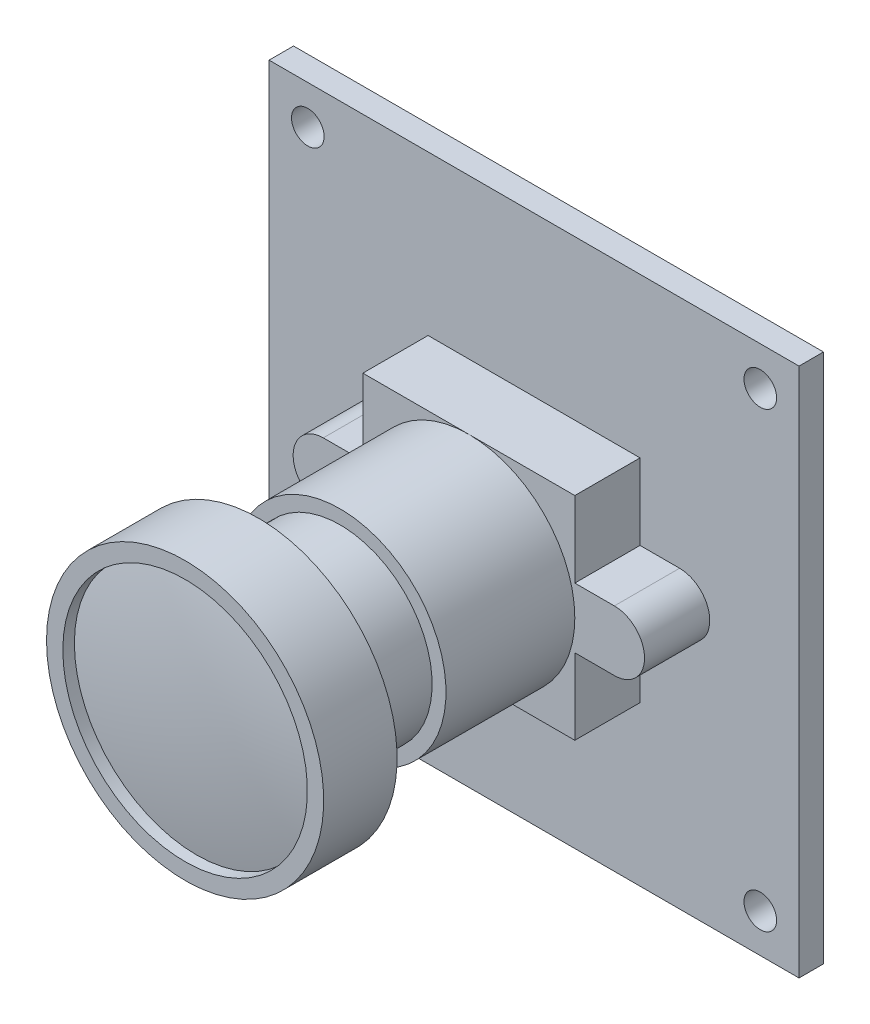
ISO-10303-21;
HEADER;
FILE_DESCRIPTION(('STEP AP214'),'2;1');
FILE_NAME('part.step','',(''),(''),'','','');
FILE_SCHEMA(('AUTOMOTIVE_DESIGN { 1 0 10303 214 1 1 1 1 }'));
ENDSEC;
DATA;
#1=APPLICATION_CONTEXT('core data for automotive mechanical design processes');
#2=APPLICATION_PROTOCOL_DEFINITION('international standard','automotive_design',2000,#1);
#3=PRODUCT_CONTEXT('',#1,'mechanical');
#4=PRODUCT('Part','Part','',(#3));
#5=PRODUCT_RELATED_PRODUCT_CATEGORY('part','',(#4));
#6=PRODUCT_DEFINITION_FORMATION('','',#4);
#7=PRODUCT_DEFINITION_CONTEXT('part definition',#1,'design');
#8=PRODUCT_DEFINITION('design','',#6,#7);
#9=PRODUCT_DEFINITION_SHAPE('','',#8);
#10=(LENGTH_UNIT() NAMED_UNIT(*) SI_UNIT(.MILLI.,.METRE.));
#11=(NAMED_UNIT(*) PLANE_ANGLE_UNIT() SI_UNIT($,.RADIAN.));
#12=(NAMED_UNIT(*) SI_UNIT($,.STERADIAN.) SOLID_ANGLE_UNIT());
#13=UNCERTAINTY_MEASURE_WITH_UNIT(LENGTH_MEASURE(1.E-05),#10,'distance_accuracy_value','');
#14=(GEOMETRIC_REPRESENTATION_CONTEXT(3) GLOBAL_UNCERTAINTY_ASSIGNED_CONTEXT((#13)) GLOBAL_UNIT_ASSIGNED_CONTEXT((#10,
#11,#12)) REPRESENTATION_CONTEXT('',''));
#15=CARTESIAN_POINT('',(0.,0.,0.));
#16=DIRECTION('',(0.,0.,1.));
#17=DIRECTION('',(1.,0.,0.));
#18=AXIS2_PLACEMENT_3D('',#15,#16,#17);
#19=CARTESIAN_POINT('',(0.,0.,0.));
#20=DIRECTION('',(0.,0.,1.));
#21=DIRECTION('',(1.,0.,0.));
#22=AXIS2_PLACEMENT_3D('',#19,#20,#21);
#23=PLANE('',#22);
#24=CARTESIAN_POINT('',(-13.875,13.875,0.));
#25=DIRECTION('',(0.,0.,1.));
#26=DIRECTION('',(1.,0.,0.));
#27=AXIS2_PLACEMENT_3D('',#24,#25,#26);
#28=CIRCLE('',#27,1.);
#29=CARTESIAN_POINT('',(-12.875,13.875,0.));
#30=VERTEX_POINT('',#29);
#31=EDGE_CURVE('E396',#30,#30,#28,.T.);
#32=ORIENTED_EDGE('',*,*,#31,.T.);
#33=EDGE_LOOP('',(#32));
#34=FACE_BOUND('',#33,.T.);
#35=CARTESIAN_POINT('',(-13.875,-13.875,0.));
#36=DIRECTION('',(0.,0.,1.));
#37=DIRECTION('',(1.,0.,0.));
#38=AXIS2_PLACEMENT_3D('',#35,#36,#37);
#39=CIRCLE('',#38,1.);
#40=CARTESIAN_POINT('',(-12.875,-13.875,0.));
#41=VERTEX_POINT('',#40);
#42=EDGE_CURVE('E401',#41,#41,#39,.T.);
#43=ORIENTED_EDGE('',*,*,#42,.T.);
#44=EDGE_LOOP('',(#43));
#45=FACE_BOUND('',#44,.T.);
#46=CARTESIAN_POINT('',(13.875,-13.875,0.));
#47=DIRECTION('',(0.,0.,1.));
#48=DIRECTION('',(1.,0.,0.));
#49=AXIS2_PLACEMENT_3D('',#46,#47,#48);
#50=CIRCLE('',#49,1.);
#51=CARTESIAN_POINT('',(14.875,-13.875,0.));
#52=VERTEX_POINT('',#51);
#53=EDGE_CURVE('E409',#52,#52,#50,.T.);
#54=ORIENTED_EDGE('',*,*,#53,.T.);
#55=EDGE_LOOP('',(#54));
#56=FACE_BOUND('',#55,.T.);
#57=CARTESIAN_POINT('',(13.875,13.875,0.));
#58=DIRECTION('',(0.,0.,1.));
#59=DIRECTION('',(1.,0.,0.));
#60=AXIS2_PLACEMENT_3D('',#57,#58,#59);
#61=CIRCLE('',#60,1.);
#62=CARTESIAN_POINT('',(14.875,13.875,0.));
#63=VERTEX_POINT('',#62);
#64=EDGE_CURVE('E417',#63,#63,#61,.T.);
#65=ORIENTED_EDGE('',*,*,#64,.T.);
#66=EDGE_LOOP('',(#65));
#67=FACE_BOUND('',#66,.T.);
#68=DIRECTION('',(0.,-1.,0.));
#69=VECTOR('',#68,1.);
#70=CARTESIAN_POINT('',(5.,-16.25,0.));
#71=LINE('',#70,#69);
#72=CARTESIAN_POINT('',(5.,-11.5,0.));
#73=VERTEX_POINT('',#72);
#74=CARTESIAN_POINT('',(5.,-16.25,0.));
#75=VERTEX_POINT('',#74);
#76=EDGE_CURVE('E93',#73,#75,#71,.T.);
#77=ORIENTED_EDGE('',*,*,#76,.F.);
#78=DIRECTION('',(1.,0.,0.));
#79=VECTOR('',#78,1.);
#80=CARTESIAN_POINT('',(-5.,-11.5,0.));
#81=LINE('',#80,#79);
#82=CARTESIAN_POINT('',(-5.,-11.5,0.));
#83=VERTEX_POINT('',#82);
#84=EDGE_CURVE('E241',#83,#73,#81,.T.);
#85=ORIENTED_EDGE('',*,*,#84,.F.);
#86=DIRECTION('',(0.,1.,0.));
#87=VECTOR('',#86,1.);
#88=CARTESIAN_POINT('',(-5.,-16.25,0.));
#89=LINE('',#88,#87);
#90=CARTESIAN_POINT('',(-5.,-16.25,0.));
#91=VERTEX_POINT('',#90);
#92=EDGE_CURVE('E476',#91,#83,#89,.T.);
#93=ORIENTED_EDGE('',*,*,#92,.F.);
#94=DIRECTION('',(1.,0.,0.));
#95=VECTOR('',#94,1.);
#96=CARTESIAN_POINT('',(16.25,-16.25,0.));
#97=LINE('',#96,#95);
#98=CARTESIAN_POINT('',(-16.25,-16.25,0.));
#99=VERTEX_POINT('',#98);
#100=EDGE_CURVE('E447',#99,#91,#97,.T.);
#101=ORIENTED_EDGE('',*,*,#100,.F.);
#102=DIRECTION('',(0.,-1.,0.));
#103=VECTOR('',#102,1.);
#104=CARTESIAN_POINT('',(-16.25,-16.25,0.));
#105=LINE('',#104,#103);
#106=CARTESIAN_POINT('',(-16.25,16.25,0.));
#107=VERTEX_POINT('',#106);
#108=EDGE_CURVE('E425',#107,#99,#105,.T.);
#109=ORIENTED_EDGE('',*,*,#108,.F.);
#110=DIRECTION('',(-1.,0.,0.));
#111=VECTOR('',#110,1.);
#112=CARTESIAN_POINT('',(16.25,16.25,0.));
#113=LINE('',#112,#111);
#114=CARTESIAN_POINT('',(16.25,16.25,0.));
#115=VERTEX_POINT('',#114);
#116=EDGE_CURVE('E434',#115,#107,#113,.T.);
#117=ORIENTED_EDGE('',*,*,#116,.F.);
#118=DIRECTION('',(0.,1.,0.));
#119=VECTOR('',#118,1.);
#120=CARTESIAN_POINT('',(16.25,-16.25,0.));
#121=LINE('',#120,#119);
#122=CARTESIAN_POINT('',(16.25,-16.25,0.));
#123=VERTEX_POINT('',#122);
#124=EDGE_CURVE('E450',#123,#115,#121,.T.);
#125=ORIENTED_EDGE('',*,*,#124,.F.);
#126=EDGE_CURVE('E98',#75,#123,#97,.T.);
#127=ORIENTED_EDGE('',*,*,#126,.F.);
#128=EDGE_LOOP('',(#77,#85,#93,#101,#109,#117,#125,#127));
#129=FACE_BOUND('',#128,.T.);
#130=ADVANCED_FACE('F75',(#34,#45,#56,#67,#129),#23,.F.);
#131=CARTESIAN_POINT('',(0.,0.,5.5));
#132=DIRECTION('',(0.,0.,-1.));
#133=DIRECTION('',(-1.,0.,0.));
#134=AXIS2_PLACEMENT_3D('',#131,#132,#133);
#135=PLANE('',#134);
#136=DIRECTION('',(-1.,0.,0.));
#137=VECTOR('',#136,1.);
#138=CARTESIAN_POINT('',(6.5,6.5,5.5));
#139=LINE('',#138,#137);
#140=CARTESIAN_POINT('',(6.5,6.5,5.5));
#141=VERTEX_POINT('',#140);
#142=CARTESIAN_POINT('',(0.,6.5,5.5));
#143=VERTEX_POINT('',#142);
#144=EDGE_CURVE('E282',#141,#143,#139,.T.);
#145=ORIENTED_EDGE('',*,*,#144,.T.);
#146=CARTESIAN_POINT('',(0.,0.,5.5));
#147=DIRECTION('',(0.,0.,-1.));
#148=DIRECTION('',(-1.,0.,0.));
#149=AXIS2_PLACEMENT_3D('',#146,#147,#148);
#150=CIRCLE('',#149,6.5);
#151=CARTESIAN_POINT('',(0.,-6.5,5.5));
#152=VERTEX_POINT('',#151);
#153=EDGE_CURVE('E86',#143,#152,#150,.T.);
#154=ORIENTED_EDGE('',*,*,#153,.T.);
#155=DIRECTION('',(-1.,0.,0.));
#156=VECTOR('',#155,1.);
#157=CARTESIAN_POINT('',(6.5,-6.5,5.5));
#158=LINE('',#157,#156);
#159=CARTESIAN_POINT('',(6.5,-6.5,5.5));
#160=VERTEX_POINT('',#159);
#161=EDGE_CURVE('E293',#160,#152,#158,.T.);
#162=ORIENTED_EDGE('',*,*,#161,.F.);
#163=DIRECTION('',(0.,1.,0.));
#164=VECTOR('',#163,1.);
#165=CARTESIAN_POINT('',(6.5,-6.5,5.5));
#166=LINE('',#165,#164);
#167=CARTESIAN_POINT('',(6.5,-1.85,5.5));
#168=VERTEX_POINT('',#167);
#169=EDGE_CURVE('E298',#160,#168,#166,.T.);
#170=ORIENTED_EDGE('',*,*,#169,.T.);
#171=DIRECTION('',(-1.,0.,0.));
#172=VECTOR('',#171,1.);
#173=CARTESIAN_POINT('',(8.925,-1.84999999999999,5.5));
#174=LINE('',#173,#172);
#175=CARTESIAN_POINT('',(8.925,-1.84999999999999,5.5));
#176=VERTEX_POINT('',#175);
#177=EDGE_CURVE('E351',#176,#168,#174,.T.);
#178=ORIENTED_EDGE('',*,*,#177,.F.);
#179=CARTESIAN_POINT('',(8.925,0.,5.5));
#180=DIRECTION('',(0.,0.,1.));
#181=DIRECTION('',(1.,0.,0.));
#182=AXIS2_PLACEMENT_3D('',#179,#180,#181);
#183=CIRCLE('',#182,1.85);
#184=CARTESIAN_POINT('',(8.925,1.85000000000001,5.5));
#185=VERTEX_POINT('',#184);
#186=EDGE_CURVE('E336',#176,#185,#183,.T.);
#187=ORIENTED_EDGE('',*,*,#186,.T.);
#188=DIRECTION('',(-1.,0.,0.));
#189=VECTOR('',#188,1.);
#190=CARTESIAN_POINT('',(8.925,1.85000000000001,5.5));
#191=LINE('',#190,#189);
#192=CARTESIAN_POINT('',(6.5,1.85,5.5));
#193=VERTEX_POINT('',#192);
#194=EDGE_CURVE('E342',#185,#193,#191,.T.);
#195=ORIENTED_EDGE('',*,*,#194,.T.);
#196=EDGE_CURVE('E297',#193,#141,#166,.T.);
#197=ORIENTED_EDGE('',*,*,#196,.T.);
#198=EDGE_LOOP('',(#145,#154,#162,#170,#178,#187,#195,#197));
#199=FACE_BOUND('',#198,.T.);
#200=ADVANCED_FACE('F507',(#199),#135,.F.);
#201=CARTESIAN_POINT('',(0.,0.,1.5));
#202=DIRECTION('',(0.,0.,1.));
#203=DIRECTION('',(1.,0.,0.));
#204=AXIS2_PLACEMENT_3D('',#201,#202,#203);
#205=PLANE('',#204);
#206=DIRECTION('',(-1.,0.,0.));
#207=VECTOR('',#206,1.);
#208=CARTESIAN_POINT('',(8.925,-1.84999999999999,1.5));
#209=LINE('',#208,#207);
#210=CARTESIAN_POINT('',(8.925,-1.85,1.5));
#211=VERTEX_POINT('',#210);
#212=CARTESIAN_POINT('',(6.5,-1.85,1.5));
#213=VERTEX_POINT('',#212);
#214=EDGE_CURVE('E341',#211,#213,#209,.T.);
#215=ORIENTED_EDGE('',*,*,#214,.T.);
#216=DIRECTION('',(0.,1.,0.));
#217=VECTOR('',#216,1.);
#218=CARTESIAN_POINT('',(6.5,-6.5,1.5));
#219=LINE('',#218,#217);
#220=CARTESIAN_POINT('',(6.5,-6.5,1.5));
#221=VERTEX_POINT('',#220);
#222=EDGE_CURVE('E316',#221,#213,#219,.T.);
#223=ORIENTED_EDGE('',*,*,#222,.F.);
#224=DIRECTION('',(-1.,0.,0.));
#225=VECTOR('',#224,1.);
#226=CARTESIAN_POINT('',(6.5,-6.5,1.5));
#227=LINE('',#226,#225);
#228=CARTESIAN_POINT('',(-6.5,-6.5,1.5));
#229=VERTEX_POINT('',#228);
#230=EDGE_CURVE('E312',#221,#229,#227,.T.);
#231=ORIENTED_EDGE('',*,*,#230,.T.);
#232=DIRECTION('',(0.,1.,0.));
#233=VECTOR('',#232,1.);
#234=CARTESIAN_POINT('',(-6.5,-6.5,1.5));
#235=LINE('',#234,#233);
#236=CARTESIAN_POINT('',(-6.5,-1.85,1.5));
#237=VERTEX_POINT('',#236);
#238=EDGE_CURVE('E309',#229,#237,#235,.T.);
#239=ORIENTED_EDGE('',*,*,#238,.T.);
#240=CARTESIAN_POINT('',(-8.925,-1.85,1.5));
#241=VERTEX_POINT('',#240);
#242=EDGE_CURVE('E368',#237,#241,#209,.T.);
#243=ORIENTED_EDGE('',*,*,#242,.T.);
#244=CARTESIAN_POINT('',(-8.925,0.,1.5));
#245=DIRECTION('',(0.,0.,1.));
#246=DIRECTION('',(1.,0.,0.));
#247=AXIS2_PLACEMENT_3D('',#244,#245,#246);
#248=CIRCLE('',#247,1.85);
#249=CARTESIAN_POINT('',(-8.925,1.85,1.5));
#250=VERTEX_POINT('',#249);
#251=EDGE_CURVE('E364',#250,#241,#248,.T.);
#252=ORIENTED_EDGE('',*,*,#251,.F.);
#253=DIRECTION('',(-1.,0.,0.));
#254=VECTOR('',#253,1.);
#255=CARTESIAN_POINT('',(8.925,1.85000000000001,1.5));
#256=LINE('',#255,#254);
#257=CARTESIAN_POINT('',(-6.5,1.85,1.5));
#258=VERTEX_POINT('',#257);
#259=EDGE_CURVE('E359',#258,#250,#256,.T.);
#260=ORIENTED_EDGE('',*,*,#259,.F.);
#261=CARTESIAN_POINT('',(-6.5,6.5,1.5));
#262=VERTEX_POINT('',#261);
#263=EDGE_CURVE('E307',#258,#262,#235,.T.);
#264=ORIENTED_EDGE('',*,*,#263,.T.);
#265=DIRECTION('',(-1.,0.,0.));
#266=VECTOR('',#265,1.);
#267=CARTESIAN_POINT('',(6.5,6.5,1.5));
#268=LINE('',#267,#266);
#269=CARTESIAN_POINT('',(6.5,6.5,1.5));
#270=VERTEX_POINT('',#269);
#271=EDGE_CURVE('E303',#270,#262,#268,.T.);
#272=ORIENTED_EDGE('',*,*,#271,.F.);
#273=CARTESIAN_POINT('',(6.5,1.85,1.5));
#274=VERTEX_POINT('',#273);
#275=EDGE_CURVE('E315',#274,#270,#219,.T.);
#276=ORIENTED_EDGE('',*,*,#275,.F.);
#277=CARTESIAN_POINT('',(8.925,1.85000000000001,1.5));
#278=VERTEX_POINT('',#277);
#279=EDGE_CURVE('E360',#278,#274,#256,.T.);
#280=ORIENTED_EDGE('',*,*,#279,.F.);
#281=CARTESIAN_POINT('',(8.925,0.,1.5));
#282=DIRECTION('',(0.,0.,1.));
#283=DIRECTION('',(1.,0.,0.));
#284=AXIS2_PLACEMENT_3D('',#281,#282,#283);
#285=CIRCLE('',#284,1.85);
#286=EDGE_CURVE('E281',#211,#278,#285,.T.);
#287=ORIENTED_EDGE('',*,*,#286,.F.);
#288=EDGE_LOOP('',(#215,#223,#231,#239,#243,#252,#260,#264,#272,#276,#280,#287));
#289=FACE_BOUND('',#288,.T.);
#290=CARTESIAN_POINT('',(-13.875,-13.875,1.5));
#291=DIRECTION('',(0.,0.,1.));
#292=DIRECTION('',(1.,0.,0.));
#293=AXIS2_PLACEMENT_3D('',#290,#291,#292);
#294=CIRCLE('',#293,1.);
#295=CARTESIAN_POINT('',(-12.875,-13.875,1.5));
#296=VERTEX_POINT('',#295);
#297=EDGE_CURVE('E405',#296,#296,#294,.T.);
#298=ORIENTED_EDGE('',*,*,#297,.F.);
#299=EDGE_LOOP('',(#298));
#300=FACE_BOUND('',#299,.T.);
#301=CARTESIAN_POINT('',(13.875,13.875,1.5));
#302=DIRECTION('',(0.,0.,1.));
#303=DIRECTION('',(1.,0.,0.));
#304=AXIS2_PLACEMENT_3D('',#301,#302,#303);
#305=CIRCLE('',#304,1.);
#306=CARTESIAN_POINT('',(14.875,13.875,1.5));
#307=VERTEX_POINT('',#306);
#308=EDGE_CURVE('E421',#307,#307,#305,.T.);
#309=ORIENTED_EDGE('',*,*,#308,.F.);
#310=EDGE_LOOP('',(#309));
#311=FACE_BOUND('',#310,.T.);
#312=DIRECTION('',(0.,-1.,0.));
#313=VECTOR('',#312,1.);
#314=CARTESIAN_POINT('',(-16.25,-16.25,1.5));
#315=LINE('',#314,#313);
#316=CARTESIAN_POINT('',(-16.25,16.25,1.5));
#317=VERTEX_POINT('',#316);
#318=CARTESIAN_POINT('',(-16.25,-16.25,1.5));
#319=VERTEX_POINT('',#318);
#320=EDGE_CURVE('E429',#317,#319,#315,.T.);
#321=ORIENTED_EDGE('',*,*,#320,.T.);
#322=DIRECTION('',(1.,0.,0.));
#323=VECTOR('',#322,1.);
#324=CARTESIAN_POINT('',(16.25,-16.25,1.5));
#325=LINE('',#324,#323);
#326=CARTESIAN_POINT('',(16.25,-16.25,1.5));
#327=VERTEX_POINT('',#326);
#328=EDGE_CURVE('E433',#319,#327,#325,.T.);
#329=ORIENTED_EDGE('',*,*,#328,.T.);
#330=DIRECTION('',(0.,1.,0.));
#331=VECTOR('',#330,1.);
#332=CARTESIAN_POINT('',(16.25,-16.25,1.5));
#333=LINE('',#332,#331);
#334=CARTESIAN_POINT('',(16.25,16.25,1.5));
#335=VERTEX_POINT('',#334);
#336=EDGE_CURVE('E437',#327,#335,#333,.T.);
#337=ORIENTED_EDGE('',*,*,#336,.T.);
#338=DIRECTION('',(-1.,0.,0.));
#339=VECTOR('',#338,1.);
#340=CARTESIAN_POINT('',(16.25,16.25,1.5));
#341=LINE('',#340,#339);
#342=EDGE_CURVE('E440',#335,#317,#341,.T.);
#343=ORIENTED_EDGE('',*,*,#342,.T.);
#344=EDGE_LOOP('',(#321,#329,#337,#343));
#345=FACE_BOUND('',#344,.T.);
#346=CARTESIAN_POINT('',(13.875,-13.875,1.5));
#347=DIRECTION('',(0.,0.,1.));
#348=DIRECTION('',(1.,0.,0.));
#349=AXIS2_PLACEMENT_3D('',#346,#347,#348);
#350=CIRCLE('',#349,1.);
#351=CARTESIAN_POINT('',(14.875,-13.875,1.5));
#352=VERTEX_POINT('',#351);
#353=EDGE_CURVE('E413',#352,#352,#350,.T.);
#354=ORIENTED_EDGE('',*,*,#353,.F.);
#355=EDGE_LOOP('',(#354));
#356=FACE_BOUND('',#355,.T.);
#357=CARTESIAN_POINT('',(-13.875,13.875,1.5));
#358=DIRECTION('',(0.,0.,1.));
#359=DIRECTION('',(1.,0.,0.));
#360=AXIS2_PLACEMENT_3D('',#357,#358,#359);
#361=CIRCLE('',#360,1.);
#362=CARTESIAN_POINT('',(-12.875,13.875,1.5));
#363=VERTEX_POINT('',#362);
#364=EDGE_CURVE('E397',#363,#363,#361,.T.);
#365=ORIENTED_EDGE('',*,*,#364,.F.);
#366=EDGE_LOOP('',(#365));
#367=FACE_BOUND('',#366,.T.);
#368=ADVANCED_FACE('F515',(#289,#300,#311,#345,#356,#367),#205,.T.);
#369=CARTESIAN_POINT('',(-16.25,-16.25,1.5));
#370=DIRECTION('',(1.,0.,0.));
#371=DIRECTION('',(0.,0.,-1.));
#372=AXIS2_PLACEMENT_3D('',#369,#370,#371);
#373=PLANE('',#372);
#374=ORIENTED_EDGE('',*,*,#108,.T.);
#375=DIRECTION('',(0.,0.,-1.));
#376=VECTOR('',#375,1.);
#377=CARTESIAN_POINT('',(-16.25,-16.25,1.5));
#378=LINE('',#377,#376);
#379=EDGE_CURVE('E79',#319,#99,#378,.T.);
#380=ORIENTED_EDGE('',*,*,#379,.F.);
#381=ORIENTED_EDGE('',*,*,#320,.F.);
#382=DIRECTION('',(0.,0.,-1.));
#383=VECTOR('',#382,1.);
#384=CARTESIAN_POINT('',(-16.25,16.25,1.5));
#385=LINE('',#384,#383);
#386=EDGE_CURVE('E443',#317,#107,#385,.T.);
#387=ORIENTED_EDGE('',*,*,#386,.T.);
#388=EDGE_LOOP('',(#374,#380,#381,#387));
#389=FACE_BOUND('',#388,.T.);
#390=ADVANCED_FACE('F77',(#389),#373,.F.);
#391=CARTESIAN_POINT('',(16.25,-16.25,1.5));
#392=DIRECTION('',(0.,1.,0.));
#393=DIRECTION('',(-1.,0.,0.));
#394=AXIS2_PLACEMENT_3D('',#391,#392,#393);
#395=PLANE('',#394);
#396=ORIENTED_EDGE('',*,*,#100,.T.);
#397=DIRECTION('',(0.,0.,1.));
#398=VECTOR('',#397,1.);
#399=CARTESIAN_POINT('',(-5.,-16.25,-6.));
#400=LINE('',#399,#398);
#401=CARTESIAN_POINT('',(-5.,-16.25,-6.));
#402=VERTEX_POINT('',#401);
#403=EDGE_CURVE('E226',#402,#91,#400,.T.);
#404=ORIENTED_EDGE('',*,*,#403,.F.);
#405=DIRECTION('',(-1.,0.,0.));
#406=VECTOR('',#405,1.);
#407=CARTESIAN_POINT('',(-5.,-16.25,-6.));
#408=LINE('',#407,#406);
#409=CARTESIAN_POINT('',(5.,-16.25,-6.));
#410=VERTEX_POINT('',#409);
#411=EDGE_CURVE('E219',#410,#402,#408,.T.);
#412=ORIENTED_EDGE('',*,*,#411,.F.);
#413=DIRECTION('',(0.,0.,1.));
#414=VECTOR('',#413,1.);
#415=CARTESIAN_POINT('',(5.,-16.25,-6.));
#416=LINE('',#415,#414);
#417=EDGE_CURVE('E224',#410,#75,#416,.T.);
#418=ORIENTED_EDGE('',*,*,#417,.T.);
#419=ORIENTED_EDGE('',*,*,#126,.T.);
#420=DIRECTION('',(0.,0.,-1.));
#421=VECTOR('',#420,1.);
#422=CARTESIAN_POINT('',(16.25,-16.25,1.5));
#423=LINE('',#422,#421);
#424=EDGE_CURVE('E461',#327,#123,#423,.T.);
#425=ORIENTED_EDGE('',*,*,#424,.F.);
#426=ORIENTED_EDGE('',*,*,#328,.F.);
#427=ORIENTED_EDGE('',*,*,#379,.T.);
#428=EDGE_LOOP('',(#396,#404,#412,#418,#419,#425,#426,#427));
#429=FACE_BOUND('',#428,.T.);
#430=ADVANCED_FACE('F222',(#429),#395,.F.);
#431=CARTESIAN_POINT('',(16.25,-16.25,1.5));
#432=DIRECTION('',(-1.,0.,0.));
#433=DIRECTION('',(0.,0.,1.));
#434=AXIS2_PLACEMENT_3D('',#431,#432,#433);
#435=PLANE('',#434);
#436=ORIENTED_EDGE('',*,*,#124,.T.);
#437=DIRECTION('',(0.,0.,-1.));
#438=VECTOR('',#437,1.);
#439=CARTESIAN_POINT('',(16.25,16.25,1.5));
#440=LINE('',#439,#438);
#441=EDGE_CURVE('E458',#335,#115,#440,.T.);
#442=ORIENTED_EDGE('',*,*,#441,.F.);
#443=ORIENTED_EDGE('',*,*,#336,.F.);
#444=ORIENTED_EDGE('',*,*,#424,.T.);
#445=EDGE_LOOP('',(#436,#442,#443,#444));
#446=FACE_BOUND('',#445,.T.);
#447=ADVANCED_FACE('F527',(#446),#435,.F.);
#448=CARTESIAN_POINT('',(16.25,16.25,1.5));
#449=DIRECTION('',(0.,-1.,0.));
#450=DIRECTION('',(1.,0.,0.));
#451=AXIS2_PLACEMENT_3D('',#448,#449,#450);
#452=PLANE('',#451);
#453=ORIENTED_EDGE('',*,*,#116,.T.);
#454=ORIENTED_EDGE('',*,*,#386,.F.);
#455=ORIENTED_EDGE('',*,*,#342,.F.);
#456=ORIENTED_EDGE('',*,*,#441,.T.);
#457=EDGE_LOOP('',(#453,#454,#455,#456));
#458=FACE_BOUND('',#457,.T.);
#459=ADVANCED_FACE('F523',(#458),#452,.F.);
#460=CARTESIAN_POINT('',(13.875,13.875,1.5));
#461=DIRECTION('',(0.,0.,-1.));
#462=DIRECTION('',(-1.,0.,0.));
#463=AXIS2_PLACEMENT_3D('',#460,#461,#462);
#464=CYLINDRICAL_SURFACE('',#463,1.);
#465=ORIENTED_EDGE('',*,*,#308,.T.);
#466=EDGE_LOOP('',(#465));
#467=FACE_BOUND('',#466,.T.);
#468=ORIENTED_EDGE('',*,*,#64,.F.);
#469=EDGE_LOOP('',(#468));
#470=FACE_BOUND('',#469,.T.);
#471=ADVANCED_FACE('F526',(#467,#470),#464,.F.);
#472=CARTESIAN_POINT('',(13.875,-13.875,1.5));
#473=DIRECTION('',(0.,0.,-1.));
#474=DIRECTION('',(-1.,0.,0.));
#475=AXIS2_PLACEMENT_3D('',#472,#473,#474);
#476=CYLINDRICAL_SURFACE('',#475,1.);
#477=ORIENTED_EDGE('',*,*,#353,.T.);
#478=EDGE_LOOP('',(#477));
#479=FACE_BOUND('',#478,.T.);
#480=ORIENTED_EDGE('',*,*,#53,.F.);
#481=EDGE_LOOP('',(#480));
#482=FACE_BOUND('',#481,.T.);
#483=ADVANCED_FACE('F566',(#479,#482),#476,.F.);
#484=CARTESIAN_POINT('',(-13.875,-13.875,1.5));
#485=DIRECTION('',(0.,0.,-1.));
#486=DIRECTION('',(-1.,0.,0.));
#487=AXIS2_PLACEMENT_3D('',#484,#485,#486);
#488=CYLINDRICAL_SURFACE('',#487,1.);
#489=ORIENTED_EDGE('',*,*,#297,.T.);
#490=EDGE_LOOP('',(#489));
#491=FACE_BOUND('',#490,.T.);
#492=ORIENTED_EDGE('',*,*,#42,.F.);
#493=EDGE_LOOP('',(#492));
#494=FACE_BOUND('',#493,.T.);
#495=ADVANCED_FACE('F556',(#491,#494),#488,.F.);
#496=CARTESIAN_POINT('',(-13.875,13.875,1.5));
#497=DIRECTION('',(0.,0.,-1.));
#498=DIRECTION('',(-1.,0.,0.));
#499=AXIS2_PLACEMENT_3D('',#496,#497,#498);
#500=CYLINDRICAL_SURFACE('',#499,1.);
#501=ORIENTED_EDGE('',*,*,#364,.T.);
#502=EDGE_LOOP('',(#501));
#503=FACE_BOUND('',#502,.T.);
#504=ORIENTED_EDGE('',*,*,#31,.F.);
#505=EDGE_LOOP('',(#504));
#506=FACE_BOUND('',#505,.T.);
#507=ADVANCED_FACE('F553',(#503,#506),#500,.F.);
#508=CARTESIAN_POINT('',(-6.5,-6.5,5.5));
#509=DIRECTION('',(-1.,0.,0.));
#510=DIRECTION('',(0.,0.,1.));
#511=AXIS2_PLACEMENT_3D('',#508,#509,#510);
#512=PLANE('',#511);
#513=DIRECTION('',(0.,0.,1.));
#514=VECTOR('',#513,1.);
#515=CARTESIAN_POINT('',(-6.5,-1.85,5.5));
#516=LINE('',#515,#514);
#517=CARTESIAN_POINT('',(-6.5,-1.85,5.5));
#518=VERTEX_POINT('',#517);
#519=EDGE_CURVE('E388',#237,#518,#516,.T.);
#520=ORIENTED_EDGE('',*,*,#519,.F.);
#521=ORIENTED_EDGE('',*,*,#238,.F.);
#522=DIRECTION('',(0.,0.,-1.));
#523=VECTOR('',#522,1.);
#524=CARTESIAN_POINT('',(-6.5,-6.5,5.5));
#525=LINE('',#524,#523);
#526=CARTESIAN_POINT('',(-6.5,-6.5,5.5));
#527=VERTEX_POINT('',#526);
#528=EDGE_CURVE('E327',#527,#229,#525,.T.);
#529=ORIENTED_EDGE('',*,*,#528,.F.);
#530=DIRECTION('',(0.,1.,0.));
#531=VECTOR('',#530,1.);
#532=CARTESIAN_POINT('',(-6.5,-6.5,5.5));
#533=LINE('',#532,#531);
#534=EDGE_CURVE('E288',#527,#518,#533,.T.);
#535=ORIENTED_EDGE('',*,*,#534,.T.);
#536=EDGE_LOOP('',(#520,#521,#529,#535));
#537=FACE_BOUND('',#536,.T.);
#538=ADVANCED_FACE('F555',(#537),#512,.T.);
#539=CARTESIAN_POINT('',(6.5,-6.5,5.5));
#540=DIRECTION('',(0.,-1.,0.));
#541=DIRECTION('',(1.,0.,0.));
#542=AXIS2_PLACEMENT_3D('',#539,#540,#541);
#543=PLANE('',#542);
#544=ORIENTED_EDGE('',*,*,#230,.F.);
#545=DIRECTION('',(0.,0.,-1.));
#546=VECTOR('',#545,1.);
#547=CARTESIAN_POINT('',(6.5,-6.5,5.5));
#548=LINE('',#547,#546);
#549=EDGE_CURVE('E323',#160,#221,#548,.T.);
#550=ORIENTED_EDGE('',*,*,#549,.F.);
#551=ORIENTED_EDGE('',*,*,#161,.T.);
#552=EDGE_CURVE('E292',#152,#527,#158,.T.);
#553=ORIENTED_EDGE('',*,*,#552,.T.);
#554=ORIENTED_EDGE('',*,*,#528,.T.);
#555=EDGE_LOOP('',(#544,#550,#551,#553,#554));
#556=FACE_BOUND('',#555,.T.);
#557=ADVANCED_FACE('F562',(#556),#543,.T.);
#558=CARTESIAN_POINT('',(6.5,-6.5,5.5));
#559=DIRECTION('',(-1.,0.,0.));
#560=DIRECTION('',(0.,0.,1.));
#561=AXIS2_PLACEMENT_3D('',#558,#559,#560);
#562=PLANE('',#561);
#563=ORIENTED_EDGE('',*,*,#222,.T.);
#564=DIRECTION('',(0.,0.,1.));
#565=VECTOR('',#564,1.);
#566=CARTESIAN_POINT('',(6.5,-1.85,5.5));
#567=LINE('',#566,#565);
#568=EDGE_CURVE('E335',#213,#168,#567,.T.);
#569=ORIENTED_EDGE('',*,*,#568,.T.);
#570=ORIENTED_EDGE('',*,*,#169,.F.);
#571=ORIENTED_EDGE('',*,*,#549,.T.);
#572=EDGE_LOOP('',(#563,#569,#570,#571));
#573=FACE_BOUND('',#572,.T.);
#574=ADVANCED_FACE('F615',(#573),#562,.F.);
#575=ORIENTED_EDGE('',*,*,#552,.F.);
#576=EDGE_CURVE('E12',#152,#143,#150,.T.);
#577=ORIENTED_EDGE('',*,*,#576,.T.);
#578=CARTESIAN_POINT('',(-6.5,6.5,5.5));
#579=VERTEX_POINT('',#578);
#580=EDGE_CURVE('E287',#143,#579,#139,.T.);
#581=ORIENTED_EDGE('',*,*,#580,.T.);
#582=CARTESIAN_POINT('',(-6.5,1.85,5.5));
#583=VERTEX_POINT('',#582);
#584=EDGE_CURVE('E286',#583,#579,#533,.T.);
#585=ORIENTED_EDGE('',*,*,#584,.F.);
#586=CARTESIAN_POINT('',(-8.925,1.85,5.5));
#587=VERTEX_POINT('',#586);
#588=EDGE_CURVE('E340',#583,#587,#191,.T.);
#589=ORIENTED_EDGE('',*,*,#588,.T.);
#590=CARTESIAN_POINT('',(-8.925,0.,5.5));
#591=DIRECTION('',(0.,0.,1.));
#592=DIRECTION('',(1.,0.,0.));
#593=AXIS2_PLACEMENT_3D('',#590,#591,#592);
#594=CIRCLE('',#593,1.85);
#595=CARTESIAN_POINT('',(-8.925,-1.85,5.5));
#596=VERTEX_POINT('',#595);
#597=EDGE_CURVE('E346',#587,#596,#594,.T.);
#598=ORIENTED_EDGE('',*,*,#597,.T.);
#599=EDGE_CURVE('E350',#518,#596,#174,.T.);
#600=ORIENTED_EDGE('',*,*,#599,.F.);
#601=ORIENTED_EDGE('',*,*,#534,.F.);
#602=EDGE_LOOP('',(#575,#577,#581,#585,#589,#598,#600,#601));
#603=FACE_BOUND('',#602,.T.);
#604=ADVANCED_FACE('F518',(#603),#135,.F.);
#605=CARTESIAN_POINT('',(6.5,6.5,5.5));
#606=DIRECTION('',(0.,-1.,0.));
#607=DIRECTION('',(1.,0.,0.));
#608=AXIS2_PLACEMENT_3D('',#605,#606,#607);
#609=PLANE('',#608);
#610=ORIENTED_EDGE('',*,*,#271,.T.);
#611=DIRECTION('',(0.,0.,-1.));
#612=VECTOR('',#611,1.);
#613=CARTESIAN_POINT('',(-6.5,6.5,5.5));
#614=LINE('',#613,#612);
#615=EDGE_CURVE('E331',#579,#262,#614,.T.);
#616=ORIENTED_EDGE('',*,*,#615,.F.);
#617=ORIENTED_EDGE('',*,*,#580,.F.);
#618=ORIENTED_EDGE('',*,*,#144,.F.);
#619=DIRECTION('',(0.,0.,-1.));
#620=VECTOR('',#619,1.);
#621=CARTESIAN_POINT('',(6.5,6.5,5.5));
#622=LINE('',#621,#620);
#623=EDGE_CURVE('E302',#141,#270,#622,.T.);
#624=ORIENTED_EDGE('',*,*,#623,.T.);
#625=EDGE_LOOP('',(#610,#616,#617,#618,#624));
#626=FACE_BOUND('',#625,.T.);
#627=ADVANCED_FACE('F635',(#626),#609,.F.);
#628=ORIENTED_EDGE('',*,*,#263,.F.);
#629=DIRECTION('',(0.,0.,1.));
#630=VECTOR('',#629,1.);
#631=CARTESIAN_POINT('',(-6.5,1.85,5.5));
#632=LINE('',#631,#630);
#633=EDGE_CURVE('E391',#258,#583,#632,.T.);
#634=ORIENTED_EDGE('',*,*,#633,.T.);
#635=ORIENTED_EDGE('',*,*,#584,.T.);
#636=ORIENTED_EDGE('',*,*,#615,.T.);
#637=EDGE_LOOP('',(#628,#634,#635,#636));
#638=FACE_BOUND('',#637,.T.);
#639=ADVANCED_FACE('F565',(#638),#512,.T.);
#640=DIRECTION('',(0.,0.,1.));
#641=VECTOR('',#640,1.);
#642=CARTESIAN_POINT('',(6.5,1.85000000000001,5.5));
#643=LINE('',#642,#641);
#644=EDGE_CURVE('E387',#274,#193,#643,.T.);
#645=ORIENTED_EDGE('',*,*,#644,.F.);
#646=ORIENTED_EDGE('',*,*,#275,.T.);
#647=ORIENTED_EDGE('',*,*,#623,.F.);
#648=ORIENTED_EDGE('',*,*,#196,.F.);
#649=EDGE_LOOP('',(#645,#646,#647,#648));
#650=FACE_BOUND('',#649,.T.);
#651=ADVANCED_FACE('F627',(#650),#562,.F.);
#652=CARTESIAN_POINT('',(8.925,0.,5.5));
#653=DIRECTION('',(0.,0.,-1.));
#654=DIRECTION('',(-1.,0.,0.));
#655=AXIS2_PLACEMENT_3D('',#652,#653,#654);
#656=CYLINDRICAL_SURFACE('',#655,1.85);
#657=ORIENTED_EDGE('',*,*,#286,.T.);
#658=DIRECTION('',(0.,0.,-1.));
#659=VECTOR('',#658,1.);
#660=CARTESIAN_POINT('',(8.925,1.85000000000001,5.5));
#661=LINE('',#660,#659);
#662=EDGE_CURVE('E308',#185,#278,#661,.T.);
#663=ORIENTED_EDGE('',*,*,#662,.F.);
#664=ORIENTED_EDGE('',*,*,#186,.F.);
#665=DIRECTION('',(0.,0.,-1.));
#666=VECTOR('',#665,1.);
#667=CARTESIAN_POINT('',(8.925,-1.84999999999999,5.5));
#668=LINE('',#667,#666);
#669=EDGE_CURVE('E355',#176,#211,#668,.T.);
#670=ORIENTED_EDGE('',*,*,#669,.T.);
#671=EDGE_LOOP('',(#657,#663,#664,#670));
#672=FACE_BOUND('',#671,.T.);
#673=ADVANCED_FACE('F570',(#672),#656,.T.);
#674=CARTESIAN_POINT('',(8.925,1.85000000000001,5.5));
#675=DIRECTION('',(0.,-1.,0.));
#676=DIRECTION('',(1.,0.,0.));
#677=AXIS2_PLACEMENT_3D('',#674,#675,#676);
#678=PLANE('',#677);
#679=ORIENTED_EDGE('',*,*,#279,.T.);
#680=ORIENTED_EDGE('',*,*,#644,.T.);
#681=ORIENTED_EDGE('',*,*,#194,.F.);
#682=ORIENTED_EDGE('',*,*,#662,.T.);
#683=EDGE_LOOP('',(#679,#680,#681,#682));
#684=FACE_BOUND('',#683,.T.);
#685=ADVANCED_FACE('F672',(#684),#678,.F.);
#686=CARTESIAN_POINT('',(8.925,-1.84999999999999,5.5));
#687=DIRECTION('',(0.,-1.,0.));
#688=DIRECTION('',(1.,0.,0.));
#689=AXIS2_PLACEMENT_3D('',#686,#687,#688);
#690=PLANE('',#689);
#691=ORIENTED_EDGE('',*,*,#568,.F.);
#692=ORIENTED_EDGE('',*,*,#214,.F.);
#693=ORIENTED_EDGE('',*,*,#669,.F.);
#694=ORIENTED_EDGE('',*,*,#177,.T.);
#695=EDGE_LOOP('',(#691,#692,#693,#694));
#696=FACE_BOUND('',#695,.T.);
#697=ADVANCED_FACE('F681',(#696),#690,.T.);
#698=ORIENTED_EDGE('',*,*,#633,.F.);
#699=ORIENTED_EDGE('',*,*,#259,.T.);
#700=DIRECTION('',(0.,0.,-1.));
#701=VECTOR('',#700,1.);
#702=CARTESIAN_POINT('',(-8.925,1.85,5.5));
#703=LINE('',#702,#701);
#704=EDGE_CURVE('E378',#587,#250,#703,.T.);
#705=ORIENTED_EDGE('',*,*,#704,.F.);
#706=ORIENTED_EDGE('',*,*,#588,.F.);
#707=EDGE_LOOP('',(#698,#699,#705,#706));
#708=FACE_BOUND('',#707,.T.);
#709=ADVANCED_FACE('F683',(#708),#678,.F.);
#710=CARTESIAN_POINT('',(-8.925,0.,5.5));
#711=DIRECTION('',(0.,0.,-1.));
#712=DIRECTION('',(-1.,0.,0.));
#713=AXIS2_PLACEMENT_3D('',#710,#711,#712);
#714=CYLINDRICAL_SURFACE('',#713,1.85);
#715=ORIENTED_EDGE('',*,*,#251,.T.);
#716=DIRECTION('',(0.,0.,-1.));
#717=VECTOR('',#716,1.);
#718=CARTESIAN_POINT('',(-8.925,-1.85,5.5));
#719=LINE('',#718,#717);
#720=EDGE_CURVE('E374',#596,#241,#719,.T.);
#721=ORIENTED_EDGE('',*,*,#720,.F.);
#722=ORIENTED_EDGE('',*,*,#597,.F.);
#723=ORIENTED_EDGE('',*,*,#704,.T.);
#724=EDGE_LOOP('',(#715,#721,#722,#723));
#725=FACE_BOUND('',#724,.T.);
#726=ADVANCED_FACE('F701',(#725),#714,.T.);
#727=ORIENTED_EDGE('',*,*,#242,.F.);
#728=ORIENTED_EDGE('',*,*,#519,.T.);
#729=ORIENTED_EDGE('',*,*,#599,.T.);
#730=ORIENTED_EDGE('',*,*,#720,.T.);
#731=EDGE_LOOP('',(#727,#728,#729,#730));
#732=FACE_BOUND('',#731,.T.);
#733=ADVANCED_FACE('F693',(#732),#690,.T.);
#734=CARTESIAN_POINT('',(0.,0.,0.));
#735=DIRECTION('',(0.,0.,-1.));
#736=DIRECTION('',(-1.,0.,0.));
#737=AXIS2_PLACEMENT_3D('',#734,#735,#736);
#738=CYLINDRICAL_SURFACE('',#737,6.5);
#739=ORIENTED_EDGE('',*,*,#153,.F.);
#740=ORIENTED_EDGE('',*,*,#576,.F.);
#741=EDGE_LOOP('',(#739,#740));
#742=FACE_BOUND('',#741,.T.);
#743=CARTESIAN_POINT('',(0.,0.,13.4));
#744=DIRECTION('',(0.,0.,-1.));
#745=DIRECTION('',(-1.,0.,0.));
#746=AXIS2_PLACEMENT_3D('',#743,#744,#745);
#747=CIRCLE('',#746,6.5);
#748=CARTESIAN_POINT('',(-6.5,0.,13.4));
#749=VERTEX_POINT('',#748);
#750=EDGE_CURVE('E275',#749,#749,#747,.T.);
#751=ORIENTED_EDGE('',*,*,#750,.T.);
#752=EDGE_LOOP('',(#751));
#753=FACE_BOUND('',#752,.T.);
#754=ADVANCED_FACE('F719',(#742,#753),#738,.T.);
#755=CARTESIAN_POINT('',(6.5,0.,13.4));
#756=DIRECTION('',(0.,0.,-1.));
#757=DIRECTION('',(-1.,0.,0.));
#758=AXIS2_PLACEMENT_3D('',#755,#756,#757);
#759=PLANE('',#758);
#760=ORIENTED_EDGE('',*,*,#750,.F.);
#761=EDGE_LOOP('',(#760));
#762=FACE_BOUND('',#761,.T.);
#763=CARTESIAN_POINT('',(0.,0.,13.4));
#764=DIRECTION('',(0.,0.,-1.));
#765=DIRECTION('',(-1.,0.,0.));
#766=AXIS2_PLACEMENT_3D('',#763,#764,#765);
#767=CIRCLE('',#766,5.65);
#768=CARTESIAN_POINT('',(-5.65,0.,13.4));
#769=VERTEX_POINT('',#768);
#770=EDGE_CURVE('E271',#769,#769,#767,.T.);
#771=ORIENTED_EDGE('',*,*,#770,.T.);
#772=EDGE_LOOP('',(#771));
#773=FACE_BOUND('',#772,.T.);
#774=ADVANCED_FACE('F735',(#762,#773),#759,.F.);
#775=CARTESIAN_POINT('',(0.,0.,0.));
#776=DIRECTION('',(0.,0.,-1.));
#777=DIRECTION('',(-1.,0.,0.));
#778=AXIS2_PLACEMENT_3D('',#775,#776,#777);
#779=CYLINDRICAL_SURFACE('',#778,5.65);
#780=ORIENTED_EDGE('',*,*,#770,.F.);
#781=EDGE_LOOP('',(#780));
#782=FACE_BOUND('',#781,.T.);
#783=CARTESIAN_POINT('',(0.,0.,18.4));
#784=DIRECTION('',(0.,0.,-1.));
#785=DIRECTION('',(-1.,0.,0.));
#786=AXIS2_PLACEMENT_3D('',#783,#784,#785);
#787=CIRCLE('',#786,5.65);
#788=CARTESIAN_POINT('',(-5.65,0.,18.4));
#789=VERTEX_POINT('',#788);
#790=EDGE_CURVE('E267',#789,#789,#787,.T.);
#791=ORIENTED_EDGE('',*,*,#790,.T.);
#792=EDGE_LOOP('',(#791));
#793=FACE_BOUND('',#792,.T.);
#794=ADVANCED_FACE('F745',(#782,#793),#779,.T.);
#795=CARTESIAN_POINT('',(5.65,0.,18.4));
#796=DIRECTION('',(0.,0.,1.));
#797=DIRECTION('',(1.,0.,0.));
#798=AXIS2_PLACEMENT_3D('',#795,#796,#797);
#799=PLANE('',#798);
#800=ORIENTED_EDGE('',*,*,#790,.F.);
#801=EDGE_LOOP('',(#800));
#802=FACE_BOUND('',#801,.T.);
#803=CARTESIAN_POINT('',(0.,0.,18.4));
#804=DIRECTION('',(0.,0.,-1.));
#805=DIRECTION('',(-1.,0.,0.));
#806=AXIS2_PLACEMENT_3D('',#803,#804,#805);
#807=CIRCLE('',#806,8.5);
#808=CARTESIAN_POINT('',(-8.5,0.,18.4));
#809=VERTEX_POINT('',#808);
#810=EDGE_CURVE('E263',#809,#809,#807,.T.);
#811=ORIENTED_EDGE('',*,*,#810,.T.);
#812=EDGE_LOOP('',(#811));
#813=FACE_BOUND('',#812,.T.);
#814=ADVANCED_FACE('F755',(#802,#813),#799,.F.);
#815=CARTESIAN_POINT('',(0.,0.,0.));
#816=DIRECTION('',(0.,0.,-1.));
#817=DIRECTION('',(-1.,0.,0.));
#818=AXIS2_PLACEMENT_3D('',#815,#816,#817);
#819=CYLINDRICAL_SURFACE('',#818,8.5);
#820=ORIENTED_EDGE('',*,*,#810,.F.);
#821=EDGE_LOOP('',(#820));
#822=FACE_BOUND('',#821,.T.);
#823=CARTESIAN_POINT('',(0.,0.,22.9));
#824=DIRECTION('',(0.,0.,-1.));
#825=DIRECTION('',(-1.,0.,0.));
#826=AXIS2_PLACEMENT_3D('',#823,#824,#825);
#827=CIRCLE('',#826,8.50000000000001);
#828=CARTESIAN_POINT('',(-8.50000000000001,0.,22.9));
#829=VERTEX_POINT('',#828);
#830=EDGE_CURVE('E259',#829,#829,#827,.T.);
#831=ORIENTED_EDGE('',*,*,#830,.T.);
#832=EDGE_LOOP('',(#831));
#833=FACE_BOUND('',#832,.T.);
#834=ADVANCED_FACE('F765',(#822,#833),#819,.T.);
#835=CARTESIAN_POINT('',(8.50000000000001,0.,22.9));
#836=DIRECTION('',(0.,0.,-1.));
#837=DIRECTION('',(-1.,0.,0.));
#838=AXIS2_PLACEMENT_3D('',#835,#836,#837);
#839=PLANE('',#838);
#840=ORIENTED_EDGE('',*,*,#830,.F.);
#841=EDGE_LOOP('',(#840));
#842=FACE_BOUND('',#841,.T.);
#843=CARTESIAN_POINT('',(0.,0.,22.9));
#844=DIRECTION('',(0.,0.,-1.));
#845=DIRECTION('',(-1.,0.,0.));
#846=AXIS2_PLACEMENT_3D('',#843,#844,#845);
#847=CIRCLE('',#846,7.50000000000001);
#848=CARTESIAN_POINT('',(-7.50000000000001,0.,22.9));
#849=VERTEX_POINT('',#848);
#850=EDGE_CURVE('E250',#849,#849,#847,.T.);
#851=ORIENTED_EDGE('',*,*,#850,.T.);
#852=EDGE_LOOP('',(#851));
#853=FACE_BOUND('',#852,.T.);
#854=ADVANCED_FACE('F775',(#842,#853),#839,.F.);
#855=CARTESIAN_POINT('',(0.,0.,0.));
#856=DIRECTION('',(0.,0.,-1.));
#857=DIRECTION('',(-1.,0.,0.));
#858=AXIS2_PLACEMENT_3D('',#855,#856,#857);
#859=CYLINDRICAL_SURFACE('',#858,7.50000000000001);
#860=ORIENTED_EDGE('',*,*,#850,.F.);
#861=EDGE_LOOP('',(#860));
#862=FACE_BOUND('',#861,.T.);
#863=CARTESIAN_POINT('',(0.,0.,22.1905841137543));
#864=DIRECTION('',(0.,0.,-1.));
#865=DIRECTION('',(-1.,0.,0.));
#866=AXIS2_PLACEMENT_3D('',#863,#864,#865);
#867=CIRCLE('',#866,7.50000000000001);
#868=CARTESIAN_POINT('',(-7.50000000000001,0.,22.1905841137543));
#869=VERTEX_POINT('',#868);
#870=EDGE_CURVE('E245',#869,#869,#867,.T.);
#871=ORIENTED_EDGE('',*,*,#870,.T.);
#872=EDGE_LOOP('',(#871));
#873=FACE_BOUND('',#872,.T.);
#874=ADVANCED_FACE('F785',(#862,#873),#859,.F.);
#875=CARTESIAN_POINT('',(0.,0.,-17.1));
#876=DIRECTION('',(0.,0.,-1.));
#877=DIRECTION('',(1.,0.,0.));
#878=AXIS2_PLACEMENT_3D('',#875,#876,#877);
#879=SPHERICAL_SURFACE('',#878,40.);
#880=ORIENTED_EDGE('',*,*,#870,.F.);
#881=EDGE_LOOP('',(#880));
#882=FACE_BOUND('',#881,.T.);
#883=ADVANCED_FACE('F504',(#882),#879,.T.);
#884=CARTESIAN_POINT('',(5.,-16.25,-6.));
#885=DIRECTION('',(-1.,0.,0.));
#886=DIRECTION('',(0.,0.,1.));
#887=AXIS2_PLACEMENT_3D('',#884,#885,#886);
#888=PLANE('',#887);
#889=ORIENTED_EDGE('',*,*,#76,.T.);
#890=ORIENTED_EDGE('',*,*,#417,.F.);
#891=DIRECTION('',(0.,-1.,0.));
#892=VECTOR('',#891,1.);
#893=CARTESIAN_POINT('',(5.,-16.25,-6.));
#894=LINE('',#893,#892);
#895=CARTESIAN_POINT('',(5.,-11.5,-6.));
#896=VERTEX_POINT('',#895);
#897=EDGE_CURVE('E231',#896,#410,#894,.T.);
#898=ORIENTED_EDGE('',*,*,#897,.F.);
#899=DIRECTION('',(0.,0.,1.));
#900=VECTOR('',#899,1.);
#901=CARTESIAN_POINT('',(5.,-11.5,-6.));
#902=LINE('',#901,#900);
#903=EDGE_CURVE('E488',#896,#73,#902,.T.);
#904=ORIENTED_EDGE('',*,*,#903,.T.);
#905=EDGE_LOOP('',(#889,#890,#898,#904));
#906=FACE_BOUND('',#905,.T.);
#907=ADVANCED_FACE('F243',(#906),#888,.F.);
#908=CARTESIAN_POINT('',(-5.,-16.25,-6.));
#909=DIRECTION('',(1.,0.,0.));
#910=DIRECTION('',(0.,0.,-1.));
#911=AXIS2_PLACEMENT_3D('',#908,#909,#910);
#912=PLANE('',#911);
#913=ORIENTED_EDGE('',*,*,#92,.T.);
#914=DIRECTION('',(0.,0.,1.));
#915=VECTOR('',#914,1.);
#916=CARTESIAN_POINT('',(-5.,-11.5,-6.));
#917=LINE('',#916,#915);
#918=CARTESIAN_POINT('',(-5.,-11.5,-6.));
#919=VERTEX_POINT('',#918);
#920=EDGE_CURVE('E252',#919,#83,#917,.T.);
#921=ORIENTED_EDGE('',*,*,#920,.F.);
#922=DIRECTION('',(0.,1.,0.));
#923=VECTOR('',#922,1.);
#924=CARTESIAN_POINT('',(-5.,-16.25,-6.));
#925=LINE('',#924,#923);
#926=EDGE_CURVE('E230',#402,#919,#925,.T.);
#927=ORIENTED_EDGE('',*,*,#926,.F.);
#928=ORIENTED_EDGE('',*,*,#403,.T.);
#929=EDGE_LOOP('',(#913,#921,#927,#928));
#930=FACE_BOUND('',#929,.T.);
#931=ADVANCED_FACE('F493',(#930),#912,.F.);
#932=CARTESIAN_POINT('',(-5.,-11.5,-6.));
#933=DIRECTION('',(0.,-1.,0.));
#934=DIRECTION('',(1.,0.,0.));
#935=AXIS2_PLACEMENT_3D('',#932,#933,#934);
#936=PLANE('',#935);
#937=ORIENTED_EDGE('',*,*,#84,.T.);
#938=ORIENTED_EDGE('',*,*,#903,.F.);
#939=DIRECTION('',(1.,0.,0.));
#940=VECTOR('',#939,1.);
#941=CARTESIAN_POINT('',(-5.,-11.5,-6.));
#942=LINE('',#941,#940);
#943=EDGE_CURVE('E236',#919,#896,#942,.T.);
#944=ORIENTED_EDGE('',*,*,#943,.F.);
#945=ORIENTED_EDGE('',*,*,#920,.T.);
#946=EDGE_LOOP('',(#937,#938,#944,#945));
#947=FACE_BOUND('',#946,.T.);
#948=ADVANCED_FACE('F492',(#947),#936,.F.);
#949=CARTESIAN_POINT('',(0.,0.,-6.));
#950=DIRECTION('',(0.,0.,-1.));
#951=DIRECTION('',(-1.,0.,0.));
#952=AXIS2_PLACEMENT_3D('',#949,#950,#951);
#953=PLANE('',#952);
#954=ORIENTED_EDGE('',*,*,#897,.T.);
#955=ORIENTED_EDGE('',*,*,#411,.T.);
#956=ORIENTED_EDGE('',*,*,#926,.T.);
#957=ORIENTED_EDGE('',*,*,#943,.T.);
#958=EDGE_LOOP('',(#954,#955,#956,#957));
#959=FACE_BOUND('',#958,.T.);
#960=ADVANCED_FACE('F234',(#959),#953,.T.);
#961=CLOSED_SHELL('',(#130,#200,#368,#390,#430,#447,#459,#471,#483,#495,#507,#538,#557,#574,
#604,#627,#639,#651,#673,#685,#697,#709,#726,#733,#754,#774,#794,#814,#834,#854,#874,#883,#907,
#931,#948,#960));
#962=MANIFOLD_SOLID_BREP('B2',#961);
#963=ADVANCED_BREP_SHAPE_REPRESENTATION('',(#18,#962),#14);
#964=SHAPE_DEFINITION_REPRESENTATION(#9,#963);
ENDSEC;
END-ISO-10303-21;
